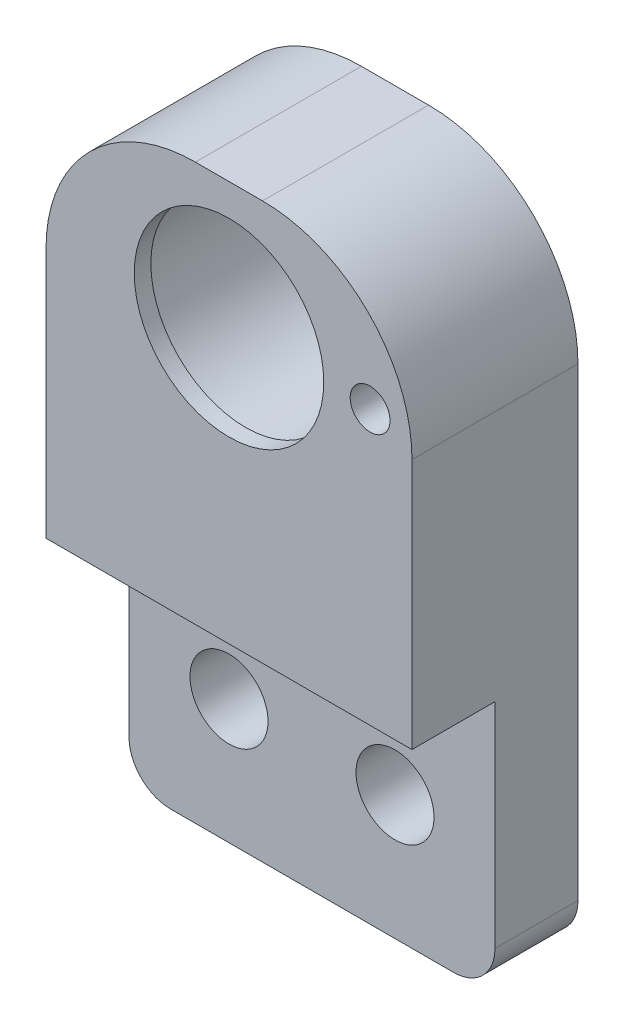
ISO-10303-21;
HEADER;
FILE_DESCRIPTION(('STEP AP214'),'2;1');
FILE_NAME('part.step','',(''),(''),'','','');
FILE_SCHEMA(('AUTOMOTIVE_DESIGN { 1 0 10303 214 1 1 1 1 }'));
ENDSEC;
DATA;
#1=APPLICATION_CONTEXT('core data for automotive mechanical design processes');
#2=APPLICATION_PROTOCOL_DEFINITION('international standard','automotive_design',2000,#1);
#3=PRODUCT_CONTEXT('',#1,'mechanical');
#4=PRODUCT('Part','Part','',(#3));
#5=PRODUCT_RELATED_PRODUCT_CATEGORY('part','',(#4));
#6=PRODUCT_DEFINITION_FORMATION('','',#4);
#7=PRODUCT_DEFINITION_CONTEXT('part definition',#1,'design');
#8=PRODUCT_DEFINITION('design','',#6,#7);
#9=PRODUCT_DEFINITION_SHAPE('','',#8);
#10=(LENGTH_UNIT() NAMED_UNIT(*) SI_UNIT(.MILLI.,.METRE.));
#11=(NAMED_UNIT(*) PLANE_ANGLE_UNIT() SI_UNIT($,.RADIAN.));
#12=(NAMED_UNIT(*) SI_UNIT($,.STERADIAN.) SOLID_ANGLE_UNIT());
#13=UNCERTAINTY_MEASURE_WITH_UNIT(LENGTH_MEASURE(1.E-05),#10,'distance_accuracy_value','');
#14=(GEOMETRIC_REPRESENTATION_CONTEXT(3) GLOBAL_UNCERTAINTY_ASSIGNED_CONTEXT((#13)) GLOBAL_UNIT_ASSIGNED_CONTEXT((#10,
#11,#12)) REPRESENTATION_CONTEXT('',''));
#15=CARTESIAN_POINT('',(0.,0.,0.));
#16=DIRECTION('',(0.,0.,1.));
#17=DIRECTION('',(1.,0.,0.));
#18=AXIS2_PLACEMENT_3D('',#15,#16,#17);
#19=CARTESIAN_POINT('',(32.85644517852,46.969993576989,12.7));
#20=DIRECTION('',(-1.,0.,0.));
#21=DIRECTION('',(0.,0.,1.));
#22=AXIS2_PLACEMENT_3D('',#19,#20,#21);
#23=PLANE('',#22);
#24=DIRECTION('',(0.,1.,0.));
#25=VECTOR('',#24,1.);
#26=CARTESIAN_POINT('',(32.85644517852,46.969993576989,6.35));
#27=LINE('',#26,#25);
#28=CARTESIAN_POINT('',(32.85644517852,69.88969534606,6.35));
#29=VERTEX_POINT('',#28);
#30=CARTESIAN_POINT('',(32.85644517852,86.23969534602,6.35));
#31=VERTEX_POINT('',#30);
#32=EDGE_CURVE('E230',#29,#31,#27,.T.);
#33=ORIENTED_EDGE('',*,*,#32,.T.);
#34=DIRECTION('',(0.,0.,1.));
#35=VECTOR('',#34,1.);
#36=CARTESIAN_POINT('',(32.85644517852,86.23969534602,6.35));
#37=LINE('',#36,#35);
#38=CARTESIAN_POINT('',(32.85644517852,86.23969534602,12.7));
#39=VERTEX_POINT('',#38);
#40=EDGE_CURVE('E219',#31,#39,#37,.T.);
#41=ORIENTED_EDGE('',*,*,#40,.T.);
#42=DIRECTION('',(0.,1.,0.));
#43=VECTOR('',#42,1.);
#44=CARTESIAN_POINT('',(32.85644517852,46.969993576989,12.7));
#45=LINE('',#44,#43);
#46=CARTESIAN_POINT('',(32.85644517852,105.44969534606,12.7));
#47=VERTEX_POINT('',#46);
#48=EDGE_CURVE('E160',#39,#47,#45,.T.);
#49=ORIENTED_EDGE('',*,*,#48,.T.);
#50=DIRECTION('',(0.,0.,-1.));
#51=VECTOR('',#50,1.);
#52=CARTESIAN_POINT('',(32.85644517852,105.44969534606,12.7));
#53=LINE('',#52,#51);
#54=CARTESIAN_POINT('',(32.85644517852,105.44969534606,0.));
#55=VERTEX_POINT('',#54);
#56=EDGE_CURVE('E39',#47,#55,#53,.T.);
#57=ORIENTED_EDGE('',*,*,#56,.T.);
#58=DIRECTION('',(0.,1.,0.));
#59=VECTOR('',#58,1.);
#60=CARTESIAN_POINT('',(32.85644517852,46.969993576989,0.));
#61=LINE('',#60,#59);
#62=CARTESIAN_POINT('',(32.85644517852,69.88969534606,0.));
#63=VERTEX_POINT('',#62);
#64=EDGE_CURVE('E157',#63,#55,#61,.T.);
#65=ORIENTED_EDGE('',*,*,#64,.F.);
#66=DIRECTION('',(0.,0.,-1.));
#67=VECTOR('',#66,1.);
#68=CARTESIAN_POINT('',(32.85644517852,69.88969534606,12.7));
#69=LINE('',#68,#67);
#70=EDGE_CURVE('E145',#29,#63,#69,.T.);
#71=ORIENTED_EDGE('',*,*,#70,.F.);
#72=EDGE_LOOP('',(#33,#41,#49,#57,#65,#71));
#73=FACE_BOUND('',#72,.T.);
#74=ADVANCED_FACE('F31',(#73),#23,.T.);
#75=CARTESIAN_POINT('',(36.03144517852,69.88969534606,12.7));
#76=DIRECTION('',(0.,0.,-1.));
#77=DIRECTION('',(-1.,0.,0.));
#78=AXIS2_PLACEMENT_3D('',#75,#76,#77);
#79=CYLINDRICAL_SURFACE('',#78,3.175);
#80=CARTESIAN_POINT('',(36.03144517852,69.88969534606,6.35));
#81=DIRECTION('',(0.,0.,1.));
#82=DIRECTION('',(1.,0.,0.));
#83=AXIS2_PLACEMENT_3D('',#80,#81,#82);
#84=CIRCLE('',#83,3.175);
#85=CARTESIAN_POINT('',(36.03144517852,66.71469534606,6.35));
#86=VERTEX_POINT('',#85);
#87=EDGE_CURVE('E124',#29,#86,#84,.T.);
#88=ORIENTED_EDGE('',*,*,#87,.F.);
#89=ORIENTED_EDGE('',*,*,#70,.T.);
#90=CARTESIAN_POINT('',(36.03144517852,69.88969534606,0.));
#91=DIRECTION('',(0.,0.,1.));
#92=DIRECTION('',(1.,0.,0.));
#93=AXIS2_PLACEMENT_3D('',#90,#91,#92);
#94=CIRCLE('',#93,3.175);
#95=CARTESIAN_POINT('',(36.03144517852,66.71469534606,0.));
#96=VERTEX_POINT('',#95);
#97=EDGE_CURVE('E173',#63,#96,#94,.T.);
#98=ORIENTED_EDGE('',*,*,#97,.T.);
#99=DIRECTION('',(0.,0.,-1.));
#100=VECTOR('',#99,1.);
#101=CARTESIAN_POINT('',(36.03144517852,66.71469534606,12.7));
#102=LINE('',#101,#100);
#103=EDGE_CURVE('E143',#86,#96,#102,.T.);
#104=ORIENTED_EDGE('',*,*,#103,.F.);
#105=EDGE_LOOP('',(#88,#89,#98,#104));
#106=FACE_BOUND('',#105,.T.);
#107=ADVANCED_FACE('F264',(#106),#79,.T.);
#108=CARTESIAN_POINT('',(46.85644517821,66.71469534606,12.7));
#109=DIRECTION('',(0.,1.,0.));
#110=DIRECTION('',(0.,0.,1.));
#111=AXIS2_PLACEMENT_3D('',#108,#109,#110);
#112=PLANE('',#111);
#113=DIRECTION('',(1.,0.,0.));
#114=VECTOR('',#113,1.);
#115=CARTESIAN_POINT('',(46.85644517821,66.71469534606,6.35));
#116=LINE('',#115,#114);
#117=CARTESIAN_POINT('',(57.6814451779,66.71469534606,6.35));
#118=VERTEX_POINT('',#117);
#119=EDGE_CURVE('E117',#86,#118,#116,.T.);
#120=ORIENTED_EDGE('',*,*,#119,.F.);
#121=ORIENTED_EDGE('',*,*,#103,.T.);
#122=DIRECTION('',(1.,0.,0.));
#123=VECTOR('',#122,1.);
#124=CARTESIAN_POINT('',(46.85644517821,66.71469534606,0.));
#125=LINE('',#124,#123);
#126=CARTESIAN_POINT('',(57.6814451779,66.71469534606,0.));
#127=VERTEX_POINT('',#126);
#128=EDGE_CURVE('E141',#96,#127,#125,.T.);
#129=ORIENTED_EDGE('',*,*,#128,.T.);
#130=DIRECTION('',(0.,0.,-1.));
#131=VECTOR('',#130,1.);
#132=CARTESIAN_POINT('',(57.6814451779,66.71469534606,12.7));
#133=LINE('',#132,#131);
#134=EDGE_CURVE('E134',#118,#127,#133,.T.);
#135=ORIENTED_EDGE('',*,*,#134,.F.);
#136=EDGE_LOOP('',(#120,#121,#129,#135));
#137=FACE_BOUND('',#136,.T.);
#138=ADVANCED_FACE('F139',(#137),#112,.F.);
#139=CARTESIAN_POINT('',(57.6814451779,69.88969534606,12.7));
#140=DIRECTION('',(0.,0.,-1.));
#141=DIRECTION('',(-1.,0.,0.));
#142=AXIS2_PLACEMENT_3D('',#139,#140,#141);
#143=CYLINDRICAL_SURFACE('',#142,3.175);
#144=CARTESIAN_POINT('',(57.6814451779,69.88969534606,6.35));
#145=DIRECTION('',(0.,0.,1.));
#146=DIRECTION('',(1.,0.,0.));
#147=AXIS2_PLACEMENT_3D('',#144,#145,#146);
#148=CIRCLE('',#147,3.175);
#149=CARTESIAN_POINT('',(60.8564451779,69.88969534606,6.35));
#150=VERTEX_POINT('',#149);
#151=EDGE_CURVE('E121',#118,#150,#148,.T.);
#152=ORIENTED_EDGE('',*,*,#151,.F.);
#153=ORIENTED_EDGE('',*,*,#134,.T.);
#154=CARTESIAN_POINT('',(57.6814451779,69.88969534606,0.));
#155=DIRECTION('',(0.,0.,1.));
#156=DIRECTION('',(1.,0.,0.));
#157=AXIS2_PLACEMENT_3D('',#154,#155,#156);
#158=CIRCLE('',#157,3.175);
#159=CARTESIAN_POINT('',(60.8564451779,69.88969534606,0.));
#160=VERTEX_POINT('',#159);
#161=EDGE_CURVE('E179',#127,#160,#158,.T.);
#162=ORIENTED_EDGE('',*,*,#161,.T.);
#163=DIRECTION('',(0.,0.,-1.));
#164=VECTOR('',#163,1.);
#165=CARTESIAN_POINT('',(60.8564451779,69.88969534606,12.7));
#166=LINE('',#165,#164);
#167=EDGE_CURVE('E136',#150,#160,#166,.T.);
#168=ORIENTED_EDGE('',*,*,#167,.F.);
#169=EDGE_LOOP('',(#152,#153,#162,#168));
#170=FACE_BOUND('',#169,.T.);
#171=ADVANCED_FACE('F132',(#170),#143,.T.);
#172=CARTESIAN_POINT('',(60.8564451779,46.969993576989,12.7));
#173=DIRECTION('',(-1.,0.,0.));
#174=DIRECTION('',(0.,0.,1.));
#175=AXIS2_PLACEMENT_3D('',#172,#173,#174);
#176=PLANE('',#175);
#177=DIRECTION('',(0.,0.,1.));
#178=VECTOR('',#177,1.);
#179=CARTESIAN_POINT('',(60.8564451779,86.23969534602,6.35));
#180=LINE('',#179,#178);
#181=CARTESIAN_POINT('',(60.8564451779,86.23969534602,6.35));
#182=VERTEX_POINT('',#181);
#183=CARTESIAN_POINT('',(60.8564451779,86.23969534602,12.7));
#184=VERTEX_POINT('',#183);
#185=EDGE_CURVE('E46',#182,#184,#180,.T.);
#186=ORIENTED_EDGE('',*,*,#185,.F.);
#187=DIRECTION('',(0.,1.,0.));
#188=VECTOR('',#187,1.);
#189=CARTESIAN_POINT('',(60.8564451779,46.969993576989,6.35));
#190=LINE('',#189,#188);
#191=EDGE_CURVE('E137',#150,#182,#190,.T.);
#192=ORIENTED_EDGE('',*,*,#191,.F.);
#193=ORIENTED_EDGE('',*,*,#167,.T.);
#194=DIRECTION('',(0.,1.,0.));
#195=VECTOR('',#194,1.);
#196=CARTESIAN_POINT('',(60.8564451779,46.969993576989,0.));
#197=LINE('',#196,#195);
#198=CARTESIAN_POINT('',(60.8564451779,105.44969534606,0.));
#199=VERTEX_POINT('',#198);
#200=EDGE_CURVE('E181',#160,#199,#197,.T.);
#201=ORIENTED_EDGE('',*,*,#200,.T.);
#202=DIRECTION('',(0.,0.,-1.));
#203=VECTOR('',#202,1.);
#204=CARTESIAN_POINT('',(60.8564451779,105.44969534606,12.7));
#205=LINE('',#204,#203);
#206=CARTESIAN_POINT('',(60.8564451779,105.44969534606,12.7));
#207=VERTEX_POINT('',#206);
#208=EDGE_CURVE('E147',#207,#199,#205,.T.);
#209=ORIENTED_EDGE('',*,*,#208,.F.);
#210=DIRECTION('',(0.,1.,0.));
#211=VECTOR('',#210,1.);
#212=CARTESIAN_POINT('',(60.8564451779,46.969993576989,12.7));
#213=LINE('',#212,#211);
#214=EDGE_CURVE('E207',#184,#207,#213,.T.);
#215=ORIENTED_EDGE('',*,*,#214,.F.);
#216=EDGE_LOOP('',(#186,#192,#193,#201,#209,#215));
#217=FACE_BOUND('',#216,.T.);
#218=ADVANCED_FACE('F250',(#217),#176,.F.);
#219=CARTESIAN_POINT('',(40.50644517948,76.23969534606,12.7));
#220=DIRECTION('',(0.,0.,-1.));
#221=DIRECTION('',(-1.,0.,0.));
#222=AXIS2_PLACEMENT_3D('',#219,#220,#221);
#223=CYLINDRICAL_SURFACE('',#222,2.9845);
#224=CARTESIAN_POINT('',(40.50644517948,76.23969534606,0.));
#225=DIRECTION('',(0.,0.,1.));
#226=DIRECTION('',(1.,0.,0.));
#227=AXIS2_PLACEMENT_3D('',#224,#225,#226);
#228=CIRCLE('',#227,2.9845);
#229=CARTESIAN_POINT('',(43.49094517948,76.23969534606,0.));
#230=VERTEX_POINT('',#229);
#231=EDGE_CURVE('E187',#230,#230,#228,.T.);
#232=ORIENTED_EDGE('',*,*,#231,.F.);
#233=EDGE_LOOP('',(#232));
#234=FACE_BOUND('',#233,.T.);
#235=CARTESIAN_POINT('',(40.50644517948,76.23969534606,6.35));
#236=DIRECTION('',(0.,0.,1.));
#237=DIRECTION('',(1.,0.,0.));
#238=AXIS2_PLACEMENT_3D('',#235,#236,#237);
#239=CIRCLE('',#238,2.9845);
#240=CARTESIAN_POINT('',(43.49094517948,76.23969534606,6.35));
#241=VERTEX_POINT('',#240);
#242=EDGE_CURVE('E128',#241,#241,#239,.T.);
#243=ORIENTED_EDGE('',*,*,#242,.T.);
#244=EDGE_LOOP('',(#243));
#245=FACE_BOUND('',#244,.T.);
#246=ADVANCED_FACE('F248',(#234,#245),#223,.F.);
#247=CARTESIAN_POINT('',(53.20644517948,76.23969534606,12.7));
#248=DIRECTION('',(0.,0.,-1.));
#249=DIRECTION('',(-1.,0.,0.));
#250=AXIS2_PLACEMENT_3D('',#247,#248,#249);
#251=CYLINDRICAL_SURFACE('',#250,2.9845);
#252=CARTESIAN_POINT('',(53.20644517948,76.23969534606,0.));
#253=DIRECTION('',(0.,0.,1.));
#254=DIRECTION('',(1.,0.,0.));
#255=AXIS2_PLACEMENT_3D('',#252,#253,#254);
#256=CIRCLE('',#255,2.9845);
#257=CARTESIAN_POINT('',(56.19094517948,76.23969534606,0.));
#258=VERTEX_POINT('',#257);
#259=EDGE_CURVE('E184',#258,#258,#256,.T.);
#260=ORIENTED_EDGE('',*,*,#259,.F.);
#261=EDGE_LOOP('',(#260));
#262=FACE_BOUND('',#261,.T.);
#263=CARTESIAN_POINT('',(53.20644517948,76.23969534606,6.35));
#264=DIRECTION('',(0.,0.,1.));
#265=DIRECTION('',(1.,0.,0.));
#266=AXIS2_PLACEMENT_3D('',#263,#264,#265);
#267=CIRCLE('',#266,2.9845);
#268=CARTESIAN_POINT('',(56.19094517948,76.23969534606,6.35));
#269=VERTEX_POINT('',#268);
#270=EDGE_CURVE('E228',#269,#269,#267,.T.);
#271=ORIENTED_EDGE('',*,*,#270,.T.);
#272=EDGE_LOOP('',(#271));
#273=FACE_BOUND('',#272,.T.);
#274=ADVANCED_FACE('F240',(#262,#273),#251,.F.);
#275=CARTESIAN_POINT('',(46.85644517821,46.969993576989,12.7));
#276=DIRECTION('',(0.,0.,1.));
#277=DIRECTION('',(1.,0.,0.));
#278=AXIS2_PLACEMENT_3D('',#275,#276,#277);
#279=PLANE('',#278);
#280=CARTESIAN_POINT('',(46.85644517948,107.1966953471,12.7));
#281=DIRECTION('',(0.,0.,1.));
#282=DIRECTION('',(1.,0.,0.));
#283=AXIS2_PLACEMENT_3D('',#280,#281,#282);
#284=CIRCLE('',#283,7.25000000086);
#285=CARTESIAN_POINT('',(54.10644518034,107.1966953471,12.7));
#286=VERTEX_POINT('',#285);
#287=EDGE_CURVE('E192',#286,#286,#284,.T.);
#288=ORIENTED_EDGE('',*,*,#287,.F.);
#289=EDGE_LOOP('',(#288));
#290=FACE_BOUND('',#289,.T.);
#291=CARTESIAN_POINT('',(57.65144517948,107.1966953471,12.7));
#292=DIRECTION('',(0.,0.,1.));
#293=DIRECTION('',(1.,0.,0.));
#294=AXIS2_PLACEMENT_3D('',#291,#292,#293);
#295=CIRCLE('',#294,1.524);
#296=CARTESIAN_POINT('',(59.17544517948,107.1966953471,12.7));
#297=VERTEX_POINT('',#296);
#298=EDGE_CURVE('E190',#297,#297,#295,.T.);
#299=ORIENTED_EDGE('',*,*,#298,.F.);
#300=EDGE_LOOP('',(#299));
#301=FACE_BOUND('',#300,.T.);
#302=ORIENTED_EDGE('',*,*,#48,.F.);
#303=DIRECTION('',(1.,0.,0.));
#304=VECTOR('',#303,1.);
#305=CARTESIAN_POINT('',(46.85644517821,86.23969534602,12.7));
#306=LINE('',#305,#304);
#307=EDGE_CURVE('E226',#39,#184,#306,.T.);
#308=ORIENTED_EDGE('',*,*,#307,.T.);
#309=ORIENTED_EDGE('',*,*,#214,.T.);
#310=CARTESIAN_POINT('',(49.4264451779,105.44969534606,12.7));
#311=DIRECTION('',(0.,0.,1.));
#312=DIRECTION('',(1.,0.,0.));
#313=AXIS2_PLACEMENT_3D('',#310,#311,#312);
#314=CIRCLE('',#313,11.43);
#315=CARTESIAN_POINT('',(49.4264451779,116.87969534606,12.7));
#316=VERTEX_POINT('',#315);
#317=EDGE_CURVE('E55',#207,#316,#314,.T.);
#318=ORIENTED_EDGE('',*,*,#317,.T.);
#319=DIRECTION('',(-1.,0.,0.));
#320=VECTOR('',#319,1.);
#321=CARTESIAN_POINT('',(46.85644517821,116.87969534606,12.7));
#322=LINE('',#321,#320);
#323=CARTESIAN_POINT('',(44.28644517852,116.87969534606,12.7));
#324=VERTEX_POINT('',#323);
#325=EDGE_CURVE('E211',#316,#324,#322,.T.);
#326=ORIENTED_EDGE('',*,*,#325,.T.);
#327=CARTESIAN_POINT('',(44.28644517852,105.44969534606,12.7));
#328=DIRECTION('',(0.,0.,1.));
#329=DIRECTION('',(1.,0.,0.));
#330=AXIS2_PLACEMENT_3D('',#327,#328,#329);
#331=CIRCLE('',#330,11.43);
#332=EDGE_CURVE('E95',#324,#47,#331,.T.);
#333=ORIENTED_EDGE('',*,*,#332,.T.);
#334=EDGE_LOOP('',(#302,#308,#309,#318,#326,#333));
#335=FACE_BOUND('',#334,.T.);
#336=ADVANCED_FACE('F257',(#290,#301,#335),#279,.T.);
#337=CARTESIAN_POINT('',(46.85644517821,46.969993576989,0.));
#338=DIRECTION('',(0.,0.,1.));
#339=DIRECTION('',(1.,0.,0.));
#340=AXIS2_PLACEMENT_3D('',#337,#338,#339);
#341=PLANE('',#340);
#342=ORIENTED_EDGE('',*,*,#231,.T.);
#343=EDGE_LOOP('',(#342));
#344=FACE_BOUND('',#343,.T.);
#345=ORIENTED_EDGE('',*,*,#259,.T.);
#346=EDGE_LOOP('',(#345));
#347=FACE_BOUND('',#346,.T.);
#348=DIRECTION('',(-1.,0.,0.));
#349=VECTOR('',#348,1.);
#350=CARTESIAN_POINT('',(46.85644517821,116.87969534606,0.));
#351=LINE('',#350,#349);
#352=CARTESIAN_POINT('',(49.4264451779,116.87969534606,0.));
#353=VERTEX_POINT('',#352);
#354=CARTESIAN_POINT('',(44.28644517852,116.87969534606,0.));
#355=VERTEX_POINT('',#354);
#356=EDGE_CURVE('E167',#353,#355,#351,.T.);
#357=ORIENTED_EDGE('',*,*,#356,.F.);
#358=CARTESIAN_POINT('',(49.4264451779,105.44969534606,0.));
#359=DIRECTION('',(0.,0.,1.));
#360=DIRECTION('',(1.,0.,0.));
#361=AXIS2_PLACEMENT_3D('',#358,#359,#360);
#362=CIRCLE('',#361,11.43);
#363=EDGE_CURVE('E88',#199,#353,#362,.T.);
#364=ORIENTED_EDGE('',*,*,#363,.F.);
#365=ORIENTED_EDGE('',*,*,#200,.F.);
#366=ORIENTED_EDGE('',*,*,#161,.F.);
#367=ORIENTED_EDGE('',*,*,#128,.F.);
#368=ORIENTED_EDGE('',*,*,#97,.F.);
#369=ORIENTED_EDGE('',*,*,#64,.T.);
#370=CARTESIAN_POINT('',(44.28644517852,105.44969534606,0.));
#371=DIRECTION('',(0.,0.,1.));
#372=DIRECTION('',(1.,0.,0.));
#373=AXIS2_PLACEMENT_3D('',#370,#371,#372);
#374=CIRCLE('',#373,11.43);
#375=EDGE_CURVE('E161',#355,#55,#374,.T.);
#376=ORIENTED_EDGE('',*,*,#375,.F.);
#377=EDGE_LOOP('',(#357,#364,#365,#366,#367,#368,#369,#376));
#378=FACE_BOUND('',#377,.T.);
#379=CARTESIAN_POINT('',(57.65144517948,107.1966953471,0.));
#380=DIRECTION('',(0.,0.,1.));
#381=DIRECTION('',(1.,0.,0.));
#382=AXIS2_PLACEMENT_3D('',#379,#380,#381);
#383=CIRCLE('',#382,1.524);
#384=CARTESIAN_POINT('',(59.17544517948,107.1966953471,0.));
#385=VERTEX_POINT('',#384);
#386=EDGE_CURVE('E199',#385,#385,#383,.T.);
#387=ORIENTED_EDGE('',*,*,#386,.T.);
#388=EDGE_LOOP('',(#387));
#389=FACE_BOUND('',#388,.T.);
#390=CARTESIAN_POINT('',(46.85644517948,107.1966953471,0.));
#391=DIRECTION('',(0.,0.,1.));
#392=DIRECTION('',(1.,0.,0.));
#393=AXIS2_PLACEMENT_3D('',#390,#391,#392);
#394=CIRCLE('',#393,7.9248);
#395=CARTESIAN_POINT('',(54.78124517948,107.1966953471,0.));
#396=VERTEX_POINT('',#395);
#397=EDGE_CURVE('E215',#396,#396,#394,.T.);
#398=ORIENTED_EDGE('',*,*,#397,.T.);
#399=EDGE_LOOP('',(#398));
#400=FACE_BOUND('',#399,.T.);
#401=ADVANCED_FACE('F170',(#344,#347,#378,#389,#400),#341,.F.);
#402=CARTESIAN_POINT('',(46.85644517821,116.87969534606,12.7));
#403=DIRECTION('',(0.,-1.,0.));
#404=DIRECTION('',(0.,0.,-1.));
#405=AXIS2_PLACEMENT_3D('',#402,#403,#404);
#406=PLANE('',#405);
#407=ORIENTED_EDGE('',*,*,#356,.T.);
#408=DIRECTION('',(0.,0.,-1.));
#409=VECTOR('',#408,1.);
#410=CARTESIAN_POINT('',(44.28644517852,116.87969534606,12.7));
#411=LINE('',#410,#409);
#412=EDGE_CURVE('E11',#324,#355,#411,.T.);
#413=ORIENTED_EDGE('',*,*,#412,.F.);
#414=ORIENTED_EDGE('',*,*,#325,.F.);
#415=DIRECTION('',(0.,0.,-1.));
#416=VECTOR('',#415,1.);
#417=CARTESIAN_POINT('',(49.4264451779,116.87969534606,12.7));
#418=LINE('',#417,#416);
#419=EDGE_CURVE('E191',#316,#353,#418,.T.);
#420=ORIENTED_EDGE('',*,*,#419,.T.);
#421=EDGE_LOOP('',(#407,#413,#414,#420));
#422=FACE_BOUND('',#421,.T.);
#423=ADVANCED_FACE('F274',(#422),#406,.F.);
#424=CARTESIAN_POINT('',(44.28644517852,105.44969534606,12.7));
#425=DIRECTION('',(0.,0.,-1.));
#426=DIRECTION('',(-1.,0.,0.));
#427=AXIS2_PLACEMENT_3D('',#424,#425,#426);
#428=CYLINDRICAL_SURFACE('',#427,11.43);
#429=ORIENTED_EDGE('',*,*,#375,.T.);
#430=ORIENTED_EDGE('',*,*,#56,.F.);
#431=ORIENTED_EDGE('',*,*,#332,.F.);
#432=ORIENTED_EDGE('',*,*,#412,.T.);
#433=EDGE_LOOP('',(#429,#430,#431,#432));
#434=FACE_BOUND('',#433,.T.);
#435=ADVANCED_FACE('F162',(#434),#428,.T.);
#436=CARTESIAN_POINT('',(49.4264451779,105.44969534606,12.7));
#437=DIRECTION('',(0.,0.,-1.));
#438=DIRECTION('',(-1.,0.,0.));
#439=AXIS2_PLACEMENT_3D('',#436,#437,#438);
#440=CYLINDRICAL_SURFACE('',#439,11.43);
#441=ORIENTED_EDGE('',*,*,#363,.T.);
#442=ORIENTED_EDGE('',*,*,#419,.F.);
#443=ORIENTED_EDGE('',*,*,#317,.F.);
#444=ORIENTED_EDGE('',*,*,#208,.T.);
#445=EDGE_LOOP('',(#441,#442,#443,#444));
#446=FACE_BOUND('',#445,.T.);
#447=ADVANCED_FACE('F194',(#446),#440,.T.);
#448=CARTESIAN_POINT('',(57.65144517948,107.1966953471,12.7));
#449=DIRECTION('',(0.,0.,-1.));
#450=DIRECTION('',(-1.,0.,0.));
#451=AXIS2_PLACEMENT_3D('',#448,#449,#450);
#452=CYLINDRICAL_SURFACE('',#451,1.524);
#453=ORIENTED_EDGE('',*,*,#298,.T.);
#454=EDGE_LOOP('',(#453));
#455=FACE_BOUND('',#454,.T.);
#456=ORIENTED_EDGE('',*,*,#386,.F.);
#457=EDGE_LOOP('',(#456));
#458=FACE_BOUND('',#457,.T.);
#459=ADVANCED_FACE('F33',(#455,#458),#452,.F.);
#460=CARTESIAN_POINT('',(46.85644517948,107.1966953471,12.7));
#461=DIRECTION('',(0.,0.,-1.));
#462=DIRECTION('',(-1.,0.,0.));
#463=AXIS2_PLACEMENT_3D('',#460,#461,#462);
#464=CYLINDRICAL_SURFACE('',#463,7.25000000086);
#465=CARTESIAN_POINT('',(46.85644517948,107.1966953471,11.43));
#466=DIRECTION('',(0.,0.,1.));
#467=DIRECTION('',(1.,0.,0.));
#468=AXIS2_PLACEMENT_3D('',#465,#466,#467);
#469=CIRCLE('',#468,7.25000000086);
#470=CARTESIAN_POINT('',(54.10644518034,107.1966953471,11.43));
#471=VERTEX_POINT('',#470);
#472=EDGE_CURVE('E218',#471,#471,#469,.T.);
#473=ORIENTED_EDGE('',*,*,#472,.F.);
#474=EDGE_LOOP('',(#473));
#475=FACE_BOUND('',#474,.T.);
#476=ORIENTED_EDGE('',*,*,#287,.T.);
#477=EDGE_LOOP('',(#476));
#478=FACE_BOUND('',#477,.T.);
#479=ADVANCED_FACE('F288',(#475,#478),#464,.F.);
#480=CARTESIAN_POINT('',(46.85644517948,107.1966953471,11.43));
#481=DIRECTION('',(0.,0.,-1.));
#482=DIRECTION('',(-1.,0.,0.));
#483=AXIS2_PLACEMENT_3D('',#480,#481,#482);
#484=CYLINDRICAL_SURFACE('',#483,7.9248);
#485=CARTESIAN_POINT('',(46.85644517948,107.1966953471,11.43));
#486=DIRECTION('',(0.,0.,1.));
#487=DIRECTION('',(1.,0.,0.));
#488=AXIS2_PLACEMENT_3D('',#485,#486,#487);
#489=CIRCLE('',#488,7.9248);
#490=CARTESIAN_POINT('',(54.78124517948,107.1966953471,11.43));
#491=VERTEX_POINT('',#490);
#492=EDGE_CURVE('E201',#491,#491,#489,.T.);
#493=ORIENTED_EDGE('',*,*,#492,.T.);
#494=EDGE_LOOP('',(#493));
#495=FACE_BOUND('',#494,.T.);
#496=ORIENTED_EDGE('',*,*,#397,.F.);
#497=EDGE_LOOP('',(#496));
#498=FACE_BOUND('',#497,.T.);
#499=ADVANCED_FACE('F290',(#495,#498),#484,.F.);
#500=CARTESIAN_POINT('',(46.85644517821,46.969993576989,11.43));
#501=DIRECTION('',(0.,0.,1.));
#502=DIRECTION('',(1.,0.,0.));
#503=AXIS2_PLACEMENT_3D('',#500,#501,#502);
#504=PLANE('',#503);
#505=ORIENTED_EDGE('',*,*,#472,.T.);
#506=EDGE_LOOP('',(#505));
#507=FACE_BOUND('',#506,.T.);
#508=ORIENTED_EDGE('',*,*,#492,.F.);
#509=EDGE_LOOP('',(#508));
#510=FACE_BOUND('',#509,.T.);
#511=ADVANCED_FACE('F296',(#507,#510),#504,.F.);
#512=CARTESIAN_POINT('',(46.85644517821,86.23969534602,6.35));
#513=DIRECTION('',(0.,-1.,0.));
#514=DIRECTION('',(0.,0.,-1.));
#515=AXIS2_PLACEMENT_3D('',#512,#513,#514);
#516=PLANE('',#515);
#517=ORIENTED_EDGE('',*,*,#307,.F.);
#518=ORIENTED_EDGE('',*,*,#40,.F.);
#519=DIRECTION('',(1.,0.,0.));
#520=VECTOR('',#519,1.);
#521=CARTESIAN_POINT('',(46.85644517821,86.23969534602,6.35));
#522=LINE('',#521,#520);
#523=EDGE_CURVE('E232',#31,#182,#522,.T.);
#524=ORIENTED_EDGE('',*,*,#523,.T.);
#525=ORIENTED_EDGE('',*,*,#185,.T.);
#526=EDGE_LOOP('',(#517,#518,#524,#525));
#527=FACE_BOUND('',#526,.T.);
#528=ADVANCED_FACE('F244',(#527),#516,.T.);
#529=CARTESIAN_POINT('',(46.85644517821,46.969993576989,6.35));
#530=DIRECTION('',(0.,0.,1.));
#531=DIRECTION('',(1.,0.,0.));
#532=AXIS2_PLACEMENT_3D('',#529,#530,#531);
#533=PLANE('',#532);
#534=ORIENTED_EDGE('',*,*,#270,.F.);
#535=EDGE_LOOP('',(#534));
#536=FACE_BOUND('',#535,.T.);
#537=ORIENTED_EDGE('',*,*,#242,.F.);
#538=EDGE_LOOP('',(#537));
#539=FACE_BOUND('',#538,.T.);
#540=ORIENTED_EDGE('',*,*,#119,.T.);
#541=ORIENTED_EDGE('',*,*,#151,.T.);
#542=ORIENTED_EDGE('',*,*,#191,.T.);
#543=ORIENTED_EDGE('',*,*,#523,.F.);
#544=ORIENTED_EDGE('',*,*,#32,.F.);
#545=ORIENTED_EDGE('',*,*,#87,.T.);
#546=EDGE_LOOP('',(#540,#541,#542,#543,#544,#545));
#547=FACE_BOUND('',#546,.T.);
#548=ADVANCED_FACE('F119',(#536,#539,#547),#533,.T.);
#549=CLOSED_SHELL('',(#74,#107,#138,#171,#218,#246,#274,#336,#401,#423,#435,#447,#459,#479,#499,
#511,#528,#548));
#550=MANIFOLD_SOLID_BREP('B2',#549);
#551=ADVANCED_BREP_SHAPE_REPRESENTATION('',(#18,#550),#14);
#552=SHAPE_DEFINITION_REPRESENTATION(#9,#551);
ENDSEC;
END-ISO-10303-21;
